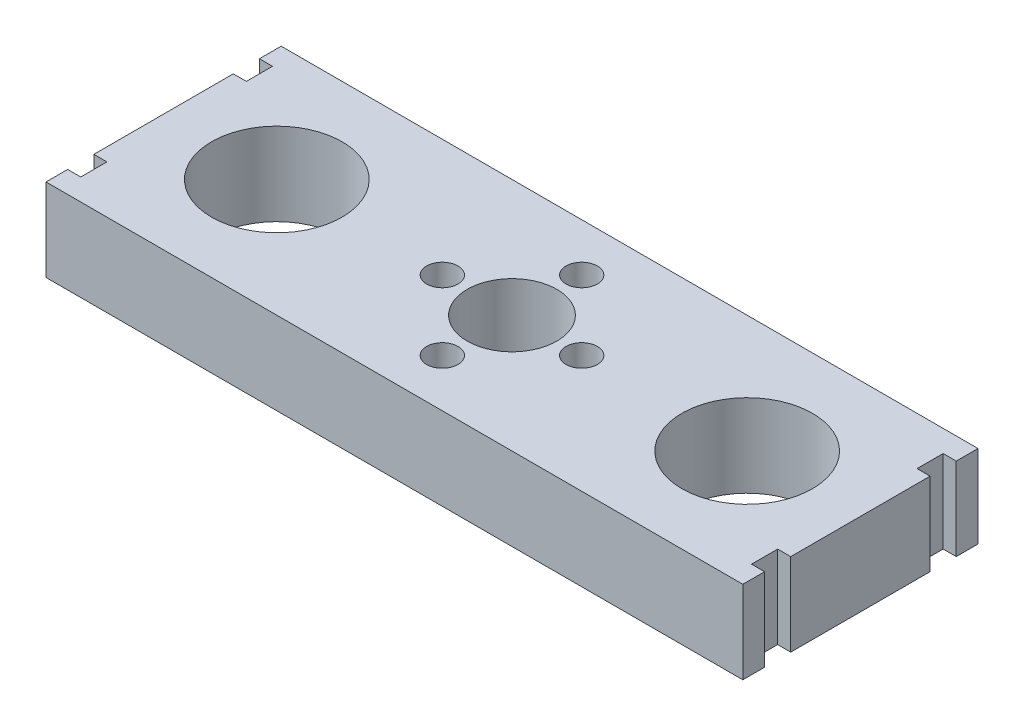
ISO-10303-21;
HEADER;
FILE_DESCRIPTION(('STEP AP214'),'2;1');
FILE_NAME('part.step','',(''),(''),'','','');
FILE_SCHEMA(('AUTOMOTIVE_DESIGN { 1 0 10303 214 1 1 1 1 }'));
ENDSEC;
DATA;
#1=APPLICATION_CONTEXT('core data for automotive mechanical design processes');
#2=APPLICATION_PROTOCOL_DEFINITION('international standard','automotive_design',2000,#1);
#3=PRODUCT_CONTEXT('',#1,'mechanical');
#4=PRODUCT('Part','Part','',(#3));
#5=PRODUCT_RELATED_PRODUCT_CATEGORY('part','',(#4));
#6=PRODUCT_DEFINITION_FORMATION('','',#4);
#7=PRODUCT_DEFINITION_CONTEXT('part definition',#1,'design');
#8=PRODUCT_DEFINITION('design','',#6,#7);
#9=PRODUCT_DEFINITION_SHAPE('','',#8);
#10=(LENGTH_UNIT() NAMED_UNIT(*) SI_UNIT(.MILLI.,.METRE.));
#11=(NAMED_UNIT(*) PLANE_ANGLE_UNIT() SI_UNIT($,.RADIAN.));
#12=(NAMED_UNIT(*) SI_UNIT($,.STERADIAN.) SOLID_ANGLE_UNIT());
#13=UNCERTAINTY_MEASURE_WITH_UNIT(LENGTH_MEASURE(1.E-05),#10,'distance_accuracy_value','');
#14=(GEOMETRIC_REPRESENTATION_CONTEXT(3) GLOBAL_UNCERTAINTY_ASSIGNED_CONTEXT((#13)) GLOBAL_UNIT_ASSIGNED_CONTEXT((#10,
#11,#12)) REPRESENTATION_CONTEXT('',''));
#15=CARTESIAN_POINT('',(0.,0.,0.));
#16=DIRECTION('',(0.,0.,1.));
#17=DIRECTION('',(1.,0.,0.));
#18=AXIS2_PLACEMENT_3D('',#15,#16,#17);
#19=CARTESIAN_POINT('',(40.,9.5,-13.5));
#20=DIRECTION('',(-1.,0.,0.));
#21=DIRECTION('',(0.,0.,1.));
#22=AXIS2_PLACEMENT_3D('',#19,#20,#21);
#23=PLANE('',#22);
#24=DIRECTION('',(0.,0.,-1.));
#25=VECTOR('',#24,1.);
#26=CARTESIAN_POINT('',(40.,0.,-13.5));
#27=LINE('',#26,#25);
#28=CARTESIAN_POINT('',(40.,0.,13.5));
#29=VERTEX_POINT('',#28);
#30=CARTESIAN_POINT('',(40.,0.,10.999861119502));
#31=VERTEX_POINT('',#30);
#32=EDGE_CURVE('E205',#29,#31,#27,.T.);
#33=ORIENTED_EDGE('',*,*,#32,.T.);
#34=DIRECTION('',(0.,1.,0.));
#35=VECTOR('',#34,1.);
#36=CARTESIAN_POINT('',(40.,0.,10.999861119502));
#37=LINE('',#36,#35);
#38=CARTESIAN_POINT('',(40.,9.5,10.999861119502));
#39=VERTEX_POINT('',#38);
#40=EDGE_CURVE('E277',#31,#39,#37,.T.);
#41=ORIENTED_EDGE('',*,*,#40,.T.);
#42=DIRECTION('',(0.,0.,-1.));
#43=VECTOR('',#42,1.);
#44=CARTESIAN_POINT('',(40.,9.5,-13.5));
#45=LINE('',#44,#43);
#46=CARTESIAN_POINT('',(40.,9.5,13.5));
#47=VERTEX_POINT('',#46);
#48=EDGE_CURVE('E219',#47,#39,#45,.T.);
#49=ORIENTED_EDGE('',*,*,#48,.F.);
#50=DIRECTION('',(0.,-1.,0.));
#51=VECTOR('',#50,1.);
#52=CARTESIAN_POINT('',(40.,9.5,13.5));
#53=LINE('',#52,#51);
#54=EDGE_CURVE('E221',#47,#29,#53,.T.);
#55=ORIENTED_EDGE('',*,*,#54,.T.);
#56=EDGE_LOOP('',(#33,#41,#49,#55));
#57=FACE_BOUND('',#56,.T.);
#58=ADVANCED_FACE('F37',(#57),#23,.F.);
#59=CARTESIAN_POINT('',(40.,9.5,7.99986111950197));
#60=VERTEX_POINT('',#59);
#61=CARTESIAN_POINT('',(40.,9.5,-8.00156328916089));
#62=VERTEX_POINT('',#61);
#63=EDGE_CURVE('E217',#60,#62,#45,.T.);
#64=ORIENTED_EDGE('',*,*,#63,.F.);
#65=DIRECTION('',(0.,1.,0.));
#66=VECTOR('',#65,1.);
#67=CARTESIAN_POINT('',(40.,0.,7.99986111950197));
#68=LINE('',#67,#66);
#69=CARTESIAN_POINT('',(40.,0.,7.99986111950197));
#70=VERTEX_POINT('',#69);
#71=EDGE_CURVE('E365',#70,#60,#68,.T.);
#72=ORIENTED_EDGE('',*,*,#71,.F.);
#73=CARTESIAN_POINT('',(40.,0.,-8.00156328916089));
#74=VERTEX_POINT('',#73);
#75=EDGE_CURVE('E339',#70,#74,#27,.T.);
#76=ORIENTED_EDGE('',*,*,#75,.T.);
#77=DIRECTION('',(0.,1.,0.));
#78=VECTOR('',#77,1.);
#79=CARTESIAN_POINT('',(40.,0.,-8.00156328916089));
#80=LINE('',#79,#78);
#81=EDGE_CURVE('E281',#74,#62,#80,.T.);
#82=ORIENTED_EDGE('',*,*,#81,.T.);
#83=EDGE_LOOP('',(#64,#72,#76,#82));
#84=FACE_BOUND('',#83,.T.);
#85=ADVANCED_FACE('F363',(#84),#23,.F.);
#86=CARTESIAN_POINT('',(-40.,9.5,-13.5));
#87=DIRECTION('',(1.,0.,0.));
#88=DIRECTION('',(0.,0.,-1.));
#89=AXIS2_PLACEMENT_3D('',#86,#87,#88);
#90=PLANE('',#89);
#91=DIRECTION('',(0.,0.,1.));
#92=VECTOR('',#91,1.);
#93=CARTESIAN_POINT('',(-40.,0.,-13.5));
#94=LINE('',#93,#92);
#95=CARTESIAN_POINT('',(-40.,0.,-13.5));
#96=VERTEX_POINT('',#95);
#97=CARTESIAN_POINT('',(-40.,0.,-11.0015632891609));
#98=VERTEX_POINT('',#97);
#99=EDGE_CURVE('E203',#96,#98,#94,.T.);
#100=ORIENTED_EDGE('',*,*,#99,.T.);
#101=DIRECTION('',(0.,1.,0.));
#102=VECTOR('',#101,1.);
#103=CARTESIAN_POINT('',(-40.,0.,-11.0015632891609));
#104=LINE('',#103,#102);
#105=CARTESIAN_POINT('',(-40.,9.5,-11.0015632891609));
#106=VERTEX_POINT('',#105);
#107=EDGE_CURVE('E256',#98,#106,#104,.T.);
#108=ORIENTED_EDGE('',*,*,#107,.T.);
#109=DIRECTION('',(0.,0.,1.));
#110=VECTOR('',#109,1.);
#111=CARTESIAN_POINT('',(-40.,9.5,-13.5));
#112=LINE('',#111,#110);
#113=CARTESIAN_POINT('',(-40.,9.5,-13.5));
#114=VERTEX_POINT('',#113);
#115=EDGE_CURVE('E229',#114,#106,#112,.T.);
#116=ORIENTED_EDGE('',*,*,#115,.F.);
#117=DIRECTION('',(0.,-1.,0.));
#118=VECTOR('',#117,1.);
#119=CARTESIAN_POINT('',(-40.,9.5,-13.5));
#120=LINE('',#119,#118);
#121=EDGE_CURVE('E45',#114,#96,#120,.T.);
#122=ORIENTED_EDGE('',*,*,#121,.T.);
#123=EDGE_LOOP('',(#100,#108,#116,#122));
#124=FACE_BOUND('',#123,.T.);
#125=ADVANCED_FACE('F227',(#124),#90,.F.);
#126=CARTESIAN_POINT('',(-40.,9.5,-8.00156328916089));
#127=VERTEX_POINT('',#126);
#128=CARTESIAN_POINT('',(-40.,9.5,8.00679833323381));
#129=VERTEX_POINT('',#128);
#130=EDGE_CURVE('E336',#127,#129,#112,.T.);
#131=ORIENTED_EDGE('',*,*,#130,.F.);
#132=DIRECTION('',(0.,1.,0.));
#133=VECTOR('',#132,1.);
#134=CARTESIAN_POINT('',(-40.,0.,-8.00156328916089));
#135=LINE('',#134,#133);
#136=CARTESIAN_POINT('',(-40.,0.,-8.00156328916089));
#137=VERTEX_POINT('',#136);
#138=EDGE_CURVE('E239',#137,#127,#135,.T.);
#139=ORIENTED_EDGE('',*,*,#138,.F.);
#140=CARTESIAN_POINT('',(-40.,0.,8.00679833323381));
#141=VERTEX_POINT('',#140);
#142=EDGE_CURVE('E200',#137,#141,#94,.T.);
#143=ORIENTED_EDGE('',*,*,#142,.T.);
#144=DIRECTION('',(0.,1.,0.));
#145=VECTOR('',#144,1.);
#146=CARTESIAN_POINT('',(-40.,0.,8.00679833323381));
#147=LINE('',#146,#145);
#148=EDGE_CURVE('E251',#141,#129,#147,.T.);
#149=ORIENTED_EDGE('',*,*,#148,.T.);
#150=EDGE_LOOP('',(#131,#139,#143,#149));
#151=FACE_BOUND('',#150,.T.);
#152=ADVANCED_FACE('F385',(#151),#90,.F.);
#153=CARTESIAN_POINT('',(40.,9.5,-11.0015632891609));
#154=VERTEX_POINT('',#153);
#155=CARTESIAN_POINT('',(40.,9.5,-13.5));
#156=VERTEX_POINT('',#155);
#157=EDGE_CURVE('E213',#154,#156,#45,.T.);
#158=ORIENTED_EDGE('',*,*,#157,.F.);
#159=DIRECTION('',(0.,1.,0.));
#160=VECTOR('',#159,1.);
#161=CARTESIAN_POINT('',(40.,0.,-11.0015632891609));
#162=LINE('',#161,#160);
#163=CARTESIAN_POINT('',(40.,0.,-11.0015632891609));
#164=VERTEX_POINT('',#163);
#165=EDGE_CURVE('E272',#164,#154,#162,.T.);
#166=ORIENTED_EDGE('',*,*,#165,.F.);
#167=CARTESIAN_POINT('',(40.,0.,-13.5));
#168=VERTEX_POINT('',#167);
#169=EDGE_CURVE('E329',#164,#168,#27,.T.);
#170=ORIENTED_EDGE('',*,*,#169,.T.);
#171=DIRECTION('',(0.,-1.,0.));
#172=VECTOR('',#171,1.);
#173=CARTESIAN_POINT('',(40.,9.5,-13.5));
#174=LINE('',#173,#172);
#175=EDGE_CURVE('E11',#156,#168,#174,.T.);
#176=ORIENTED_EDGE('',*,*,#175,.F.);
#177=EDGE_LOOP('',(#158,#166,#170,#176));
#178=FACE_BOUND('',#177,.T.);
#179=ADVANCED_FACE('F39',(#178),#23,.F.);
#180=CARTESIAN_POINT('',(-40.,9.5,-13.5));
#181=DIRECTION('',(0.,0.,1.));
#182=DIRECTION('',(1.,0.,0.));
#183=AXIS2_PLACEMENT_3D('',#180,#181,#182);
#184=PLANE('',#183);
#185=DIRECTION('',(-1.,0.,0.));
#186=VECTOR('',#185,1.);
#187=CARTESIAN_POINT('',(-40.,0.,-13.5));
#188=LINE('',#187,#186);
#189=EDGE_CURVE('E201',#168,#96,#188,.T.);
#190=ORIENTED_EDGE('',*,*,#189,.T.);
#191=ORIENTED_EDGE('',*,*,#121,.F.);
#192=DIRECTION('',(-1.,0.,0.));
#193=VECTOR('',#192,1.);
#194=CARTESIAN_POINT('',(-40.,9.5,-13.5));
#195=LINE('',#194,#193);
#196=EDGE_CURVE('E333',#156,#114,#195,.T.);
#197=ORIENTED_EDGE('',*,*,#196,.F.);
#198=ORIENTED_EDGE('',*,*,#175,.T.);
#199=EDGE_LOOP('',(#190,#191,#197,#198));
#200=FACE_BOUND('',#199,.T.);
#201=ADVANCED_FACE('F443',(#200),#184,.F.);
#202=CARTESIAN_POINT('',(-40.,9.5,11.0067983332338));
#203=VERTEX_POINT('',#202);
#204=CARTESIAN_POINT('',(-40.,9.5,13.5));
#205=VERTEX_POINT('',#204);
#206=EDGE_CURVE('E193',#203,#205,#112,.T.);
#207=ORIENTED_EDGE('',*,*,#206,.F.);
#208=DIRECTION('',(0.,1.,0.));
#209=VECTOR('',#208,1.);
#210=CARTESIAN_POINT('',(-40.,0.,11.0067983332338));
#211=LINE('',#210,#209);
#212=CARTESIAN_POINT('',(-40.,0.,11.0067983332338));
#213=VERTEX_POINT('',#212);
#214=EDGE_CURVE('E178',#213,#203,#211,.T.);
#215=ORIENTED_EDGE('',*,*,#214,.F.);
#216=CARTESIAN_POINT('',(-40.,0.,13.5));
#217=VERTEX_POINT('',#216);
#218=EDGE_CURVE('E191',#213,#217,#94,.T.);
#219=ORIENTED_EDGE('',*,*,#218,.T.);
#220=DIRECTION('',(0.,-1.,0.));
#221=VECTOR('',#220,1.);
#222=CARTESIAN_POINT('',(-40.,9.5,13.5));
#223=LINE('',#222,#221);
#224=EDGE_CURVE('E223',#205,#217,#223,.T.);
#225=ORIENTED_EDGE('',*,*,#224,.F.);
#226=EDGE_LOOP('',(#207,#215,#219,#225));
#227=FACE_BOUND('',#226,.T.);
#228=ADVANCED_FACE('F189',(#227),#90,.F.);
#229=CARTESIAN_POINT('',(-40.,9.5,13.5));
#230=DIRECTION('',(0.,0.,-1.));
#231=DIRECTION('',(-1.,0.,0.));
#232=AXIS2_PLACEMENT_3D('',#229,#230,#231);
#233=PLANE('',#232);
#234=DIRECTION('',(1.,0.,0.));
#235=VECTOR('',#234,1.);
#236=CARTESIAN_POINT('',(-40.,0.,13.5));
#237=LINE('',#236,#235);
#238=EDGE_CURVE('E199',#217,#29,#237,.T.);
#239=ORIENTED_EDGE('',*,*,#238,.T.);
#240=ORIENTED_EDGE('',*,*,#54,.F.);
#241=DIRECTION('',(1.,0.,0.));
#242=VECTOR('',#241,1.);
#243=CARTESIAN_POINT('',(-40.,9.5,13.5));
#244=LINE('',#243,#242);
#245=EDGE_CURVE('E224',#205,#47,#244,.T.);
#246=ORIENTED_EDGE('',*,*,#245,.F.);
#247=ORIENTED_EDGE('',*,*,#224,.T.);
#248=EDGE_LOOP('',(#239,#240,#246,#247));
#249=FACE_BOUND('',#248,.T.);
#250=ADVANCED_FACE('F396',(#249),#233,.F.);
#251=CARTESIAN_POINT('',(0.,9.5,0.));
#252=DIRECTION('',(0.,1.,0.));
#253=DIRECTION('',(0.,0.,1.));
#254=AXIS2_PLACEMENT_3D('',#251,#252,#253);
#255=PLANE('',#254);
#256=DIRECTION('',(1.,0.,0.));
#257=VECTOR('',#256,1.);
#258=CARTESIAN_POINT('',(40.,9.5,10.999861119502));
#259=LINE('',#258,#257);
#260=CARTESIAN_POINT('',(38.5,9.5,10.999861119502));
#261=VERTEX_POINT('',#260);
#262=EDGE_CURVE('E399',#261,#39,#259,.T.);
#263=ORIENTED_EDGE('',*,*,#262,.F.);
#264=DIRECTION('',(0.,0.,1.));
#265=VECTOR('',#264,1.);
#266=CARTESIAN_POINT('',(38.5,9.5,7.99986111950197));
#267=LINE('',#266,#265);
#268=CARTESIAN_POINT('',(38.5,9.5,7.99986111950197));
#269=VERTEX_POINT('',#268);
#270=EDGE_CURVE('E401',#269,#261,#267,.T.);
#271=ORIENTED_EDGE('',*,*,#270,.F.);
#272=DIRECTION('',(-1.,0.,0.));
#273=VECTOR('',#272,1.);
#274=CARTESIAN_POINT('',(40.,9.5,7.99986111950197));
#275=LINE('',#274,#273);
#276=EDGE_CURVE('E258',#60,#269,#275,.T.);
#277=ORIENTED_EDGE('',*,*,#276,.F.);
#278=ORIENTED_EDGE('',*,*,#63,.T.);
#279=DIRECTION('',(1.,0.,0.));
#280=VECTOR('',#279,1.);
#281=CARTESIAN_POINT('',(40.,9.5,-8.00156328916089));
#282=LINE('',#281,#280);
#283=CARTESIAN_POINT('',(38.5,9.5,-8.00156328916089));
#284=VERTEX_POINT('',#283);
#285=EDGE_CURVE('E266',#284,#62,#282,.T.);
#286=ORIENTED_EDGE('',*,*,#285,.F.);
#287=DIRECTION('',(0.,0.,1.));
#288=VECTOR('',#287,1.);
#289=CARTESIAN_POINT('',(38.5,9.5,-11.0015632891609));
#290=LINE('',#289,#288);
#291=CARTESIAN_POINT('',(38.5,9.5,-11.0015632891609));
#292=VERTEX_POINT('',#291);
#293=EDGE_CURVE('E276',#292,#284,#290,.T.);
#294=ORIENTED_EDGE('',*,*,#293,.F.);
#295=DIRECTION('',(-1.,0.,0.));
#296=VECTOR('',#295,1.);
#297=CARTESIAN_POINT('',(40.,9.5,-11.0015632891609));
#298=LINE('',#297,#296);
#299=EDGE_CURVE('E273',#154,#292,#298,.T.);
#300=ORIENTED_EDGE('',*,*,#299,.F.);
#301=ORIENTED_EDGE('',*,*,#157,.T.);
#302=ORIENTED_EDGE('',*,*,#196,.T.);
#303=ORIENTED_EDGE('',*,*,#115,.T.);
#304=DIRECTION('',(-1.,0.,0.));
#305=VECTOR('',#304,1.);
#306=CARTESIAN_POINT('',(-40.,9.5,-11.0015632891609));
#307=LINE('',#306,#305);
#308=CARTESIAN_POINT('',(-38.5,9.5,-11.0015632891609));
#309=VERTEX_POINT('',#308);
#310=EDGE_CURVE('E254',#309,#106,#307,.T.);
#311=ORIENTED_EDGE('',*,*,#310,.F.);
#312=DIRECTION('',(0.,0.,-1.));
#313=VECTOR('',#312,1.);
#314=CARTESIAN_POINT('',(-38.5,9.5,-11.0015632891609));
#315=LINE('',#314,#313);
#316=CARTESIAN_POINT('',(-38.5,9.5,-8.00156328916089));
#317=VERTEX_POINT('',#316);
#318=EDGE_CURVE('E250',#317,#309,#315,.T.);
#319=ORIENTED_EDGE('',*,*,#318,.F.);
#320=DIRECTION('',(1.,0.,0.));
#321=VECTOR('',#320,1.);
#322=CARTESIAN_POINT('',(-40.,9.5,-8.00156328916089));
#323=LINE('',#322,#321);
#324=EDGE_CURVE('E247',#127,#317,#323,.T.);
#325=ORIENTED_EDGE('',*,*,#324,.F.);
#326=ORIENTED_EDGE('',*,*,#130,.T.);
#327=DIRECTION('',(-1.,0.,0.));
#328=VECTOR('',#327,1.);
#329=CARTESIAN_POINT('',(-40.,9.5,8.00679833323381));
#330=LINE('',#329,#328);
#331=CARTESIAN_POINT('',(-38.5,9.5,8.00679833323381));
#332=VERTEX_POINT('',#331);
#333=EDGE_CURVE('E185',#332,#129,#330,.T.);
#334=ORIENTED_EDGE('',*,*,#333,.F.);
#335=DIRECTION('',(0.,0.,-1.));
#336=VECTOR('',#335,1.);
#337=CARTESIAN_POINT('',(-38.5,9.5,8.00679833323381));
#338=LINE('',#337,#336);
#339=CARTESIAN_POINT('',(-38.5,9.5,11.0067983332338));
#340=VERTEX_POINT('',#339);
#341=EDGE_CURVE('E420',#340,#332,#338,.T.);
#342=ORIENTED_EDGE('',*,*,#341,.F.);
#343=DIRECTION('',(1.,0.,0.));
#344=VECTOR('',#343,1.);
#345=CARTESIAN_POINT('',(-40.,9.5,11.0067983332338));
#346=LINE('',#345,#344);
#347=EDGE_CURVE('E395',#203,#340,#346,.T.);
#348=ORIENTED_EDGE('',*,*,#347,.F.);
#349=ORIENTED_EDGE('',*,*,#206,.T.);
#350=ORIENTED_EDGE('',*,*,#245,.T.);
#351=ORIENTED_EDGE('',*,*,#48,.T.);
#352=EDGE_LOOP('',(#263,#271,#277,#278,#286,#294,#300,#301,#302,#303,#311,#319,#325,#326,#334,
#342,#348,#349,#350,#351));
#353=FACE_BOUND('',#352,.T.);
#354=CARTESIAN_POINT('',(8.,9.5,0.));
#355=DIRECTION('',(0.,1.,0.));
#356=DIRECTION('',(0.,0.,1.));
#357=AXIS2_PLACEMENT_3D('',#354,#355,#356);
#358=CIRCLE('',#357,1.8);
#359=CARTESIAN_POINT('',(8.,9.5,1.80000000000003));
#360=VERTEX_POINT('',#359);
#361=EDGE_CURVE('E294',#360,#360,#358,.T.);
#362=ORIENTED_EDGE('',*,*,#361,.F.);
#363=EDGE_LOOP('',(#362));
#364=FACE_BOUND('',#363,.T.);
#365=CARTESIAN_POINT('',(0.,9.5,-8.));
#366=DIRECTION('',(0.,1.,0.));
#367=DIRECTION('',(0.,0.,1.));
#368=AXIS2_PLACEMENT_3D('',#365,#366,#367);
#369=CIRCLE('',#368,1.8);
#370=CARTESIAN_POINT('',(0.,9.5,-6.2));
#371=VERTEX_POINT('',#370);
#372=EDGE_CURVE('E300',#371,#371,#369,.T.);
#373=ORIENTED_EDGE('',*,*,#372,.F.);
#374=EDGE_LOOP('',(#373));
#375=FACE_BOUND('',#374,.T.);
#376=CARTESIAN_POINT('',(0.,9.5,8.));
#377=DIRECTION('',(0.,1.,0.));
#378=DIRECTION('',(0.,0.,1.));
#379=AXIS2_PLACEMENT_3D('',#376,#377,#378);
#380=CIRCLE('',#379,1.8);
#381=CARTESIAN_POINT('',(0.,9.5,9.8));
#382=VERTEX_POINT('',#381);
#383=EDGE_CURVE('E306',#382,#382,#380,.T.);
#384=ORIENTED_EDGE('',*,*,#383,.F.);
#385=EDGE_LOOP('',(#384));
#386=FACE_BOUND('',#385,.T.);
#387=CARTESIAN_POINT('',(-8.,9.5,0.));
#388=DIRECTION('',(0.,1.,0.));
#389=DIRECTION('',(0.,0.,1.));
#390=AXIS2_PLACEMENT_3D('',#387,#388,#389);
#391=CIRCLE('',#390,1.8);
#392=CARTESIAN_POINT('',(-8.,9.5,1.79999999999992));
#393=VERTEX_POINT('',#392);
#394=EDGE_CURVE('E284',#393,#393,#391,.T.);
#395=ORIENTED_EDGE('',*,*,#394,.F.);
#396=EDGE_LOOP('',(#395));
#397=FACE_BOUND('',#396,.T.);
#398=CARTESIAN_POINT('',(0.,9.5,0.));
#399=DIRECTION('',(0.,1.,0.));
#400=DIRECTION('',(0.,0.,1.));
#401=AXIS2_PLACEMENT_3D('',#398,#399,#400);
#402=CIRCLE('',#401,5.15);
#403=CARTESIAN_POINT('',(0.,9.5,5.15));
#404=VERTEX_POINT('',#403);
#405=EDGE_CURVE('E293',#404,#404,#402,.T.);
#406=ORIENTED_EDGE('',*,*,#405,.F.);
#407=EDGE_LOOP('',(#406));
#408=FACE_BOUND('',#407,.T.);
#409=CARTESIAN_POINT('',(-27.,9.5,0.));
#410=DIRECTION('',(0.,1.,0.));
#411=DIRECTION('',(0.,0.,1.));
#412=AXIS2_PLACEMENT_3D('',#409,#410,#411);
#413=CIRCLE('',#412,7.5);
#414=CARTESIAN_POINT('',(-27.,9.5,7.5));
#415=VERTEX_POINT('',#414);
#416=EDGE_CURVE('E320',#415,#415,#413,.T.);
#417=ORIENTED_EDGE('',*,*,#416,.F.);
#418=EDGE_LOOP('',(#417));
#419=FACE_BOUND('',#418,.T.);
#420=CARTESIAN_POINT('',(27.,9.5,0.));
#421=DIRECTION('',(0.,1.,0.));
#422=DIRECTION('',(0.,0.,1.));
#423=AXIS2_PLACEMENT_3D('',#420,#421,#422);
#424=CIRCLE('',#423,7.5);
#425=CARTESIAN_POINT('',(27.,9.5,7.5));
#426=VERTEX_POINT('',#425);
#427=EDGE_CURVE('E323',#426,#426,#424,.T.);
#428=ORIENTED_EDGE('',*,*,#427,.F.);
#429=EDGE_LOOP('',(#428));
#430=FACE_BOUND('',#429,.T.);
#431=ADVANCED_FACE('F391',(#353,#364,#375,#386,#397,#408,#419,#430),#255,.T.);
#432=CARTESIAN_POINT('',(0.,0.,0.));
#433=DIRECTION('',(0.,1.,0.));
#434=DIRECTION('',(0.,0.,1.));
#435=AXIS2_PLACEMENT_3D('',#432,#433,#434);
#436=PLANE('',#435);
#437=CARTESIAN_POINT('',(8.,0.,0.));
#438=DIRECTION('',(0.,1.,0.));
#439=DIRECTION('',(0.,0.,1.));
#440=AXIS2_PLACEMENT_3D('',#437,#438,#439);
#441=CIRCLE('',#440,1.8);
#442=CARTESIAN_POINT('',(8.,0.,1.80000000000003));
#443=VERTEX_POINT('',#442);
#444=EDGE_CURVE('E290',#443,#443,#441,.T.);
#445=ORIENTED_EDGE('',*,*,#444,.T.);
#446=EDGE_LOOP('',(#445));
#447=FACE_BOUND('',#446,.T.);
#448=CARTESIAN_POINT('',(0.,0.,-8.));
#449=DIRECTION('',(0.,1.,0.));
#450=DIRECTION('',(0.,0.,1.));
#451=AXIS2_PLACEMENT_3D('',#448,#449,#450);
#452=CIRCLE('',#451,1.8);
#453=CARTESIAN_POINT('',(0.,0.,-6.2));
#454=VERTEX_POINT('',#453);
#455=EDGE_CURVE('E297',#454,#454,#452,.T.);
#456=ORIENTED_EDGE('',*,*,#455,.T.);
#457=EDGE_LOOP('',(#456));
#458=FACE_BOUND('',#457,.T.);
#459=CARTESIAN_POINT('',(0.,0.,8.));
#460=DIRECTION('',(0.,1.,0.));
#461=DIRECTION('',(0.,0.,1.));
#462=AXIS2_PLACEMENT_3D('',#459,#460,#461);
#463=CIRCLE('',#462,1.8);
#464=CARTESIAN_POINT('',(0.,0.,9.8));
#465=VERTEX_POINT('',#464);
#466=EDGE_CURVE('E303',#465,#465,#463,.T.);
#467=ORIENTED_EDGE('',*,*,#466,.T.);
#468=EDGE_LOOP('',(#467));
#469=FACE_BOUND('',#468,.T.);
#470=CARTESIAN_POINT('',(-8.,0.,0.));
#471=DIRECTION('',(0.,1.,0.));
#472=DIRECTION('',(0.,0.,1.));
#473=AXIS2_PLACEMENT_3D('',#470,#471,#472);
#474=CIRCLE('',#473,1.8);
#475=CARTESIAN_POINT('',(-8.,0.,1.79999999999992));
#476=VERTEX_POINT('',#475);
#477=EDGE_CURVE('E309',#476,#476,#474,.T.);
#478=ORIENTED_EDGE('',*,*,#477,.T.);
#479=EDGE_LOOP('',(#478));
#480=FACE_BOUND('',#479,.T.);
#481=CARTESIAN_POINT('',(0.,0.,0.));
#482=DIRECTION('',(0.,1.,0.));
#483=DIRECTION('',(0.,0.,1.));
#484=AXIS2_PLACEMENT_3D('',#481,#482,#483);
#485=CIRCLE('',#484,5.15);
#486=CARTESIAN_POINT('',(0.,0.,5.15));
#487=VERTEX_POINT('',#486);
#488=EDGE_CURVE('E314',#487,#487,#485,.T.);
#489=ORIENTED_EDGE('',*,*,#488,.T.);
#490=EDGE_LOOP('',(#489));
#491=FACE_BOUND('',#490,.T.);
#492=CARTESIAN_POINT('',(-27.,0.,0.));
#493=DIRECTION('',(0.,1.,0.));
#494=DIRECTION('',(0.,0.,1.));
#495=AXIS2_PLACEMENT_3D('',#492,#493,#494);
#496=CIRCLE('',#495,7.5);
#497=CARTESIAN_POINT('',(-27.,0.,7.5));
#498=VERTEX_POINT('',#497);
#499=EDGE_CURVE('E317',#498,#498,#496,.T.);
#500=ORIENTED_EDGE('',*,*,#499,.T.);
#501=EDGE_LOOP('',(#500));
#502=FACE_BOUND('',#501,.T.);
#503=CARTESIAN_POINT('',(27.,0.,0.));
#504=DIRECTION('',(0.,1.,0.));
#505=DIRECTION('',(0.,0.,1.));
#506=AXIS2_PLACEMENT_3D('',#503,#504,#505);
#507=CIRCLE('',#506,7.5);
#508=CARTESIAN_POINT('',(27.,0.,7.5));
#509=VERTEX_POINT('',#508);
#510=EDGE_CURVE('E326',#509,#509,#507,.T.);
#511=ORIENTED_EDGE('',*,*,#510,.T.);
#512=EDGE_LOOP('',(#511));
#513=FACE_BOUND('',#512,.T.);
#514=DIRECTION('',(0.,0.,1.));
#515=VECTOR('',#514,1.);
#516=CARTESIAN_POINT('',(38.5,0.,7.99986111950197));
#517=LINE('',#516,#515);
#518=CARTESIAN_POINT('',(38.5,0.,7.99986111950197));
#519=VERTEX_POINT('',#518);
#520=CARTESIAN_POINT('',(38.5,0.,10.999861119502));
#521=VERTEX_POINT('',#520);
#522=EDGE_CURVE('E52',#519,#521,#517,.T.);
#523=ORIENTED_EDGE('',*,*,#522,.T.);
#524=DIRECTION('',(1.,0.,0.));
#525=VECTOR('',#524,1.);
#526=CARTESIAN_POINT('',(40.,0.,10.999861119502));
#527=LINE('',#526,#525);
#528=EDGE_CURVE('E370',#521,#31,#527,.T.);
#529=ORIENTED_EDGE('',*,*,#528,.T.);
#530=ORIENTED_EDGE('',*,*,#32,.F.);
#531=ORIENTED_EDGE('',*,*,#238,.F.);
#532=ORIENTED_EDGE('',*,*,#218,.F.);
#533=DIRECTION('',(1.,0.,0.));
#534=VECTOR('',#533,1.);
#535=CARTESIAN_POINT('',(-40.,0.,11.0067983332338));
#536=LINE('',#535,#534);
#537=CARTESIAN_POINT('',(-38.5,0.,11.0067983332338));
#538=VERTEX_POINT('',#537);
#539=EDGE_CURVE('E174',#213,#538,#536,.T.);
#540=ORIENTED_EDGE('',*,*,#539,.T.);
#541=DIRECTION('',(0.,0.,-1.));
#542=VECTOR('',#541,1.);
#543=CARTESIAN_POINT('',(-38.5,0.,8.00679833323381));
#544=LINE('',#543,#542);
#545=CARTESIAN_POINT('',(-38.5,0.,8.00679833323381));
#546=VERTEX_POINT('',#545);
#547=EDGE_CURVE('E184',#538,#546,#544,.T.);
#548=ORIENTED_EDGE('',*,*,#547,.T.);
#549=DIRECTION('',(-1.,0.,0.));
#550=VECTOR('',#549,1.);
#551=CARTESIAN_POINT('',(-40.,0.,8.00679833323381));
#552=LINE('',#551,#550);
#553=EDGE_CURVE('E194',#546,#141,#552,.T.);
#554=ORIENTED_EDGE('',*,*,#553,.T.);
#555=ORIENTED_EDGE('',*,*,#142,.F.);
#556=DIRECTION('',(1.,0.,0.));
#557=VECTOR('',#556,1.);
#558=CARTESIAN_POINT('',(-40.,0.,-8.00156328916089));
#559=LINE('',#558,#557);
#560=CARTESIAN_POINT('',(-38.5,0.,-8.00156328916089));
#561=VERTEX_POINT('',#560);
#562=EDGE_CURVE('E243',#137,#561,#559,.T.);
#563=ORIENTED_EDGE('',*,*,#562,.T.);
#564=DIRECTION('',(0.,0.,-1.));
#565=VECTOR('',#564,1.);
#566=CARTESIAN_POINT('',(-38.5,0.,-11.0015632891609));
#567=LINE('',#566,#565);
#568=CARTESIAN_POINT('',(-38.5,0.,-11.0015632891609));
#569=VERTEX_POINT('',#568);
#570=EDGE_CURVE('E60',#561,#569,#567,.T.);
#571=ORIENTED_EDGE('',*,*,#570,.T.);
#572=DIRECTION('',(-1.,0.,0.));
#573=VECTOR('',#572,1.);
#574=CARTESIAN_POINT('',(-40.,0.,-11.0015632891609));
#575=LINE('',#574,#573);
#576=EDGE_CURVE('E236',#569,#98,#575,.T.);
#577=ORIENTED_EDGE('',*,*,#576,.T.);
#578=ORIENTED_EDGE('',*,*,#99,.F.);
#579=ORIENTED_EDGE('',*,*,#189,.F.);
#580=ORIENTED_EDGE('',*,*,#169,.F.);
#581=DIRECTION('',(-1.,0.,0.));
#582=VECTOR('',#581,1.);
#583=CARTESIAN_POINT('',(40.,0.,-11.0015632891609));
#584=LINE('',#583,#582);
#585=CARTESIAN_POINT('',(38.5,0.,-11.0015632891609));
#586=VERTEX_POINT('',#585);
#587=EDGE_CURVE('E262',#164,#586,#584,.T.);
#588=ORIENTED_EDGE('',*,*,#587,.T.);
#589=DIRECTION('',(0.,0.,1.));
#590=VECTOR('',#589,1.);
#591=CARTESIAN_POINT('',(38.5,0.,-11.0015632891609));
#592=LINE('',#591,#590);
#593=CARTESIAN_POINT('',(38.5,0.,-8.00156328916089));
#594=VERTEX_POINT('',#593);
#595=EDGE_CURVE('E265',#586,#594,#592,.T.);
#596=ORIENTED_EDGE('',*,*,#595,.T.);
#597=DIRECTION('',(1.,0.,0.));
#598=VECTOR('',#597,1.);
#599=CARTESIAN_POINT('',(40.,0.,-8.00156328916089));
#600=LINE('',#599,#598);
#601=EDGE_CURVE('E269',#594,#74,#600,.T.);
#602=ORIENTED_EDGE('',*,*,#601,.T.);
#603=ORIENTED_EDGE('',*,*,#75,.F.);
#604=DIRECTION('',(-1.,0.,0.));
#605=VECTOR('',#604,1.);
#606=CARTESIAN_POINT('',(40.,0.,7.99986111950197));
#607=LINE('',#606,#605);
#608=EDGE_CURVE('E403',#70,#519,#607,.T.);
#609=ORIENTED_EDGE('',*,*,#608,.T.);
#610=EDGE_LOOP('',(#523,#529,#530,#531,#532,#540,#548,#554,#555,#563,#571,#577,#578,#579,#580,
#588,#596,#602,#603,#609));
#611=FACE_BOUND('',#610,.T.);
#612=ADVANCED_FACE('F197',(#447,#458,#469,#480,#491,#502,#513,#611),#436,.F.);
#613=CARTESIAN_POINT('',(27.,0.,0.));
#614=DIRECTION('',(0.,1.,0.));
#615=DIRECTION('',(0.,0.,1.));
#616=AXIS2_PLACEMENT_3D('',#613,#614,#615);
#617=CYLINDRICAL_SURFACE('',#616,7.5);
#618=ORIENTED_EDGE('',*,*,#510,.F.);
#619=EDGE_LOOP('',(#618));
#620=FACE_BOUND('',#619,.T.);
#621=ORIENTED_EDGE('',*,*,#427,.T.);
#622=EDGE_LOOP('',(#621));
#623=FACE_BOUND('',#622,.T.);
#624=ADVANCED_FACE('F463',(#620,#623),#617,.F.);
#625=CARTESIAN_POINT('',(-27.,0.,0.));
#626=DIRECTION('',(0.,1.,0.));
#627=DIRECTION('',(0.,0.,1.));
#628=AXIS2_PLACEMENT_3D('',#625,#626,#627);
#629=CYLINDRICAL_SURFACE('',#628,7.5);
#630=ORIENTED_EDGE('',*,*,#499,.F.);
#631=EDGE_LOOP('',(#630));
#632=FACE_BOUND('',#631,.T.);
#633=ORIENTED_EDGE('',*,*,#416,.T.);
#634=EDGE_LOOP('',(#633));
#635=FACE_BOUND('',#634,.T.);
#636=ADVANCED_FACE('F468',(#632,#635),#629,.F.);
#637=CARTESIAN_POINT('',(0.,0.,0.));
#638=DIRECTION('',(0.,1.,0.));
#639=DIRECTION('',(0.,0.,1.));
#640=AXIS2_PLACEMENT_3D('',#637,#638,#639);
#641=CYLINDRICAL_SURFACE('',#640,5.15);
#642=ORIENTED_EDGE('',*,*,#488,.F.);
#643=EDGE_LOOP('',(#642));
#644=FACE_BOUND('',#643,.T.);
#645=ORIENTED_EDGE('',*,*,#405,.T.);
#646=EDGE_LOOP('',(#645));
#647=FACE_BOUND('',#646,.T.);
#648=ADVANCED_FACE('F472',(#644,#647),#641,.F.);
#649=CARTESIAN_POINT('',(-8.,0.,0.));
#650=DIRECTION('',(0.,1.,0.));
#651=DIRECTION('',(0.,0.,1.));
#652=AXIS2_PLACEMENT_3D('',#649,#650,#651);
#653=CYLINDRICAL_SURFACE('',#652,1.8);
#654=ORIENTED_EDGE('',*,*,#477,.F.);
#655=EDGE_LOOP('',(#654));
#656=FACE_BOUND('',#655,.T.);
#657=ORIENTED_EDGE('',*,*,#394,.T.);
#658=EDGE_LOOP('',(#657));
#659=FACE_BOUND('',#658,.T.);
#660=ADVANCED_FACE('F476',(#656,#659),#653,.F.);
#661=CARTESIAN_POINT('',(0.,0.,8.));
#662=DIRECTION('',(0.,1.,0.));
#663=DIRECTION('',(0.,0.,1.));
#664=AXIS2_PLACEMENT_3D('',#661,#662,#663);
#665=CYLINDRICAL_SURFACE('',#664,1.8);
#666=ORIENTED_EDGE('',*,*,#466,.F.);
#667=EDGE_LOOP('',(#666));
#668=FACE_BOUND('',#667,.T.);
#669=ORIENTED_EDGE('',*,*,#383,.T.);
#670=EDGE_LOOP('',(#669));
#671=FACE_BOUND('',#670,.T.);
#672=ADVANCED_FACE('F480',(#668,#671),#665,.F.);
#673=CARTESIAN_POINT('',(0.,0.,-8.));
#674=DIRECTION('',(0.,1.,0.));
#675=DIRECTION('',(0.,0.,1.));
#676=AXIS2_PLACEMENT_3D('',#673,#674,#675);
#677=CYLINDRICAL_SURFACE('',#676,1.8);
#678=ORIENTED_EDGE('',*,*,#455,.F.);
#679=EDGE_LOOP('',(#678));
#680=FACE_BOUND('',#679,.T.);
#681=ORIENTED_EDGE('',*,*,#372,.T.);
#682=EDGE_LOOP('',(#681));
#683=FACE_BOUND('',#682,.T.);
#684=ADVANCED_FACE('F484',(#680,#683),#677,.F.);
#685=CARTESIAN_POINT('',(8.,0.,0.));
#686=DIRECTION('',(0.,1.,0.));
#687=DIRECTION('',(0.,0.,1.));
#688=AXIS2_PLACEMENT_3D('',#685,#686,#687);
#689=CYLINDRICAL_SURFACE('',#688,1.8);
#690=ORIENTED_EDGE('',*,*,#444,.F.);
#691=EDGE_LOOP('',(#690));
#692=FACE_BOUND('',#691,.T.);
#693=ORIENTED_EDGE('',*,*,#361,.T.);
#694=EDGE_LOOP('',(#693));
#695=FACE_BOUND('',#694,.T.);
#696=ADVANCED_FACE('F488',(#692,#695),#689,.F.);
#697=CARTESIAN_POINT('',(40.,0.,-8.00156328916089));
#698=DIRECTION('',(0.,0.,1.));
#699=DIRECTION('',(1.,0.,0.));
#700=AXIS2_PLACEMENT_3D('',#697,#698,#699);
#701=PLANE('',#700);
#702=ORIENTED_EDGE('',*,*,#285,.T.);
#703=ORIENTED_EDGE('',*,*,#81,.F.);
#704=ORIENTED_EDGE('',*,*,#601,.F.);
#705=DIRECTION('',(0.,1.,0.));
#706=VECTOR('',#705,1.);
#707=CARTESIAN_POINT('',(38.5,0.,-8.00156328916089));
#708=LINE('',#707,#706);
#709=EDGE_CURVE('E285',#594,#284,#708,.T.);
#710=ORIENTED_EDGE('',*,*,#709,.T.);
#711=EDGE_LOOP('',(#702,#703,#704,#710));
#712=FACE_BOUND('',#711,.T.);
#713=ADVANCED_FACE('F357',(#712),#701,.F.);
#714=CARTESIAN_POINT('',(38.5,0.,-11.0015632891609));
#715=DIRECTION('',(-1.,0.,0.));
#716=DIRECTION('',(0.,0.,1.));
#717=AXIS2_PLACEMENT_3D('',#714,#715,#716);
#718=PLANE('',#717);
#719=ORIENTED_EDGE('',*,*,#293,.T.);
#720=ORIENTED_EDGE('',*,*,#709,.F.);
#721=ORIENTED_EDGE('',*,*,#595,.F.);
#722=DIRECTION('',(0.,1.,0.));
#723=VECTOR('',#722,1.);
#724=CARTESIAN_POINT('',(38.5,0.,-11.0015632891609));
#725=LINE('',#724,#723);
#726=EDGE_CURVE('E287',#586,#292,#725,.T.);
#727=ORIENTED_EDGE('',*,*,#726,.T.);
#728=EDGE_LOOP('',(#719,#720,#721,#727));
#729=FACE_BOUND('',#728,.T.);
#730=ADVANCED_FACE('F353',(#729),#718,.F.);
#731=CARTESIAN_POINT('',(40.,0.,-11.0015632891609));
#732=DIRECTION('',(0.,0.,-1.));
#733=DIRECTION('',(-1.,0.,0.));
#734=AXIS2_PLACEMENT_3D('',#731,#732,#733);
#735=PLANE('',#734);
#736=ORIENTED_EDGE('',*,*,#299,.T.);
#737=ORIENTED_EDGE('',*,*,#726,.F.);
#738=ORIENTED_EDGE('',*,*,#587,.F.);
#739=ORIENTED_EDGE('',*,*,#165,.T.);
#740=EDGE_LOOP('',(#736,#737,#738,#739));
#741=FACE_BOUND('',#740,.T.);
#742=ADVANCED_FACE('F349',(#741),#735,.F.);
#743=CARTESIAN_POINT('',(-40.,0.,8.00679833323381));
#744=DIRECTION('',(0.,0.,-1.));
#745=DIRECTION('',(-1.,0.,0.));
#746=AXIS2_PLACEMENT_3D('',#743,#744,#745);
#747=PLANE('',#746);
#748=ORIENTED_EDGE('',*,*,#333,.T.);
#749=ORIENTED_EDGE('',*,*,#148,.F.);
#750=ORIENTED_EDGE('',*,*,#553,.F.);
#751=DIRECTION('',(0.,1.,0.));
#752=VECTOR('',#751,1.);
#753=CARTESIAN_POINT('',(-38.5,0.,8.00679833323381));
#754=LINE('',#753,#752);
#755=EDGE_CURVE('E416',#546,#332,#754,.T.);
#756=ORIENTED_EDGE('',*,*,#755,.T.);
#757=EDGE_LOOP('',(#748,#749,#750,#756));
#758=FACE_BOUND('',#757,.T.);
#759=ADVANCED_FACE('F429',(#758),#747,.F.);
#760=CARTESIAN_POINT('',(-38.5,0.,8.00679833323381));
#761=DIRECTION('',(1.,0.,0.));
#762=DIRECTION('',(0.,0.,-1.));
#763=AXIS2_PLACEMENT_3D('',#760,#761,#762);
#764=PLANE('',#763);
#765=ORIENTED_EDGE('',*,*,#341,.T.);
#766=ORIENTED_EDGE('',*,*,#755,.F.);
#767=ORIENTED_EDGE('',*,*,#547,.F.);
#768=DIRECTION('',(0.,1.,0.));
#769=VECTOR('',#768,1.);
#770=CARTESIAN_POINT('',(-38.5,0.,11.0067983332338));
#771=LINE('',#770,#769);
#772=EDGE_CURVE('E180',#538,#340,#771,.T.);
#773=ORIENTED_EDGE('',*,*,#772,.T.);
#774=EDGE_LOOP('',(#765,#766,#767,#773));
#775=FACE_BOUND('',#774,.T.);
#776=ADVANCED_FACE('F427',(#775),#764,.F.);
#777=CARTESIAN_POINT('',(-40.,0.,11.0067983332338));
#778=DIRECTION('',(0.,0.,1.));
#779=DIRECTION('',(1.,0.,0.));
#780=AXIS2_PLACEMENT_3D('',#777,#778,#779);
#781=PLANE('',#780);
#782=ORIENTED_EDGE('',*,*,#347,.T.);
#783=ORIENTED_EDGE('',*,*,#772,.F.);
#784=ORIENTED_EDGE('',*,*,#539,.F.);
#785=ORIENTED_EDGE('',*,*,#214,.T.);
#786=EDGE_LOOP('',(#782,#783,#784,#785));
#787=FACE_BOUND('',#786,.T.);
#788=ADVANCED_FACE('F177',(#787),#781,.F.);
#789=CARTESIAN_POINT('',(-40.,0.,-11.0015632891609));
#790=DIRECTION('',(0.,0.,-1.));
#791=DIRECTION('',(-1.,0.,0.));
#792=AXIS2_PLACEMENT_3D('',#789,#790,#791);
#793=PLANE('',#792);
#794=ORIENTED_EDGE('',*,*,#310,.T.);
#795=ORIENTED_EDGE('',*,*,#107,.F.);
#796=ORIENTED_EDGE('',*,*,#576,.F.);
#797=DIRECTION('',(0.,1.,0.));
#798=VECTOR('',#797,1.);
#799=CARTESIAN_POINT('',(-38.5,0.,-11.0015632891609));
#800=LINE('',#799,#798);
#801=EDGE_CURVE('E259',#569,#309,#800,.T.);
#802=ORIENTED_EDGE('',*,*,#801,.T.);
#803=EDGE_LOOP('',(#794,#795,#796,#802));
#804=FACE_BOUND('',#803,.T.);
#805=ADVANCED_FACE('F502',(#804),#793,.F.);
#806=CARTESIAN_POINT('',(-38.5,0.,-11.0015632891609));
#807=DIRECTION('',(1.,0.,0.));
#808=DIRECTION('',(0.,0.,-1.));
#809=AXIS2_PLACEMENT_3D('',#806,#807,#808);
#810=PLANE('',#809);
#811=ORIENTED_EDGE('',*,*,#318,.T.);
#812=ORIENTED_EDGE('',*,*,#801,.F.);
#813=ORIENTED_EDGE('',*,*,#570,.F.);
#814=DIRECTION('',(0.,1.,0.));
#815=VECTOR('',#814,1.);
#816=CARTESIAN_POINT('',(-38.5,0.,-8.00156328916089));
#817=LINE('',#816,#815);
#818=EDGE_CURVE('E241',#561,#317,#817,.T.);
#819=ORIENTED_EDGE('',*,*,#818,.T.);
#820=EDGE_LOOP('',(#811,#812,#813,#819));
#821=FACE_BOUND('',#820,.T.);
#822=ADVANCED_FACE('F499',(#821),#810,.F.);
#823=CARTESIAN_POINT('',(-40.,0.,-8.00156328916089));
#824=DIRECTION('',(0.,0.,1.));
#825=DIRECTION('',(1.,0.,0.));
#826=AXIS2_PLACEMENT_3D('',#823,#824,#825);
#827=PLANE('',#826);
#828=ORIENTED_EDGE('',*,*,#324,.T.);
#829=ORIENTED_EDGE('',*,*,#818,.F.);
#830=ORIENTED_EDGE('',*,*,#562,.F.);
#831=ORIENTED_EDGE('',*,*,#138,.T.);
#832=EDGE_LOOP('',(#828,#829,#830,#831));
#833=FACE_BOUND('',#832,.T.);
#834=ADVANCED_FACE('F381',(#833),#827,.F.);
#835=CARTESIAN_POINT('',(40.,0.,10.999861119502));
#836=DIRECTION('',(0.,0.,1.));
#837=DIRECTION('',(1.,0.,0.));
#838=AXIS2_PLACEMENT_3D('',#835,#836,#837);
#839=PLANE('',#838);
#840=ORIENTED_EDGE('',*,*,#262,.T.);
#841=ORIENTED_EDGE('',*,*,#40,.F.);
#842=ORIENTED_EDGE('',*,*,#528,.F.);
#843=DIRECTION('',(0.,1.,0.));
#844=VECTOR('',#843,1.);
#845=CARTESIAN_POINT('',(38.5,0.,10.999861119502));
#846=LINE('',#845,#844);
#847=EDGE_CURVE('E372',#521,#261,#846,.T.);
#848=ORIENTED_EDGE('',*,*,#847,.T.);
#849=EDGE_LOOP('',(#840,#841,#842,#848));
#850=FACE_BOUND('',#849,.T.);
#851=ADVANCED_FACE('F410',(#850),#839,.F.);
#852=CARTESIAN_POINT('',(38.5,0.,7.99986111950197));
#853=DIRECTION('',(-1.,0.,0.));
#854=DIRECTION('',(0.,0.,1.));
#855=AXIS2_PLACEMENT_3D('',#852,#853,#854);
#856=PLANE('',#855);
#857=ORIENTED_EDGE('',*,*,#270,.T.);
#858=ORIENTED_EDGE('',*,*,#847,.F.);
#859=ORIENTED_EDGE('',*,*,#522,.F.);
#860=DIRECTION('',(0.,1.,0.));
#861=VECTOR('',#860,1.);
#862=CARTESIAN_POINT('',(38.5,0.,7.99986111950197));
#863=LINE('',#862,#861);
#864=EDGE_CURVE('E369',#519,#269,#863,.T.);
#865=ORIENTED_EDGE('',*,*,#864,.T.);
#866=EDGE_LOOP('',(#857,#858,#859,#865));
#867=FACE_BOUND('',#866,.T.);
#868=ADVANCED_FACE('F411',(#867),#856,.F.);
#869=CARTESIAN_POINT('',(40.,0.,7.99986111950197));
#870=DIRECTION('',(0.,0.,-1.));
#871=DIRECTION('',(-1.,0.,0.));
#872=AXIS2_PLACEMENT_3D('',#869,#870,#871);
#873=PLANE('',#872);
#874=ORIENTED_EDGE('',*,*,#276,.T.);
#875=ORIENTED_EDGE('',*,*,#864,.F.);
#876=ORIENTED_EDGE('',*,*,#608,.F.);
#877=ORIENTED_EDGE('',*,*,#71,.T.);
#878=EDGE_LOOP('',(#874,#875,#876,#877));
#879=FACE_BOUND('',#878,.T.);
#880=ADVANCED_FACE('F412',(#879),#873,.F.);
#881=CLOSED_SHELL('',(#58,#85,#125,#152,#179,#201,#228,#250,#431,#612,#624,#636,#648,#660,#672,
#684,#696,#713,#730,#742,#759,#776,#788,#805,#822,#834,#851,#868,#880));
#882=MANIFOLD_SOLID_BREP('B2',#881);
#883=ADVANCED_BREP_SHAPE_REPRESENTATION('',(#18,#882),#14);
#884=SHAPE_DEFINITION_REPRESENTATION(#9,#883);
ENDSEC;
END-ISO-10303-21;
